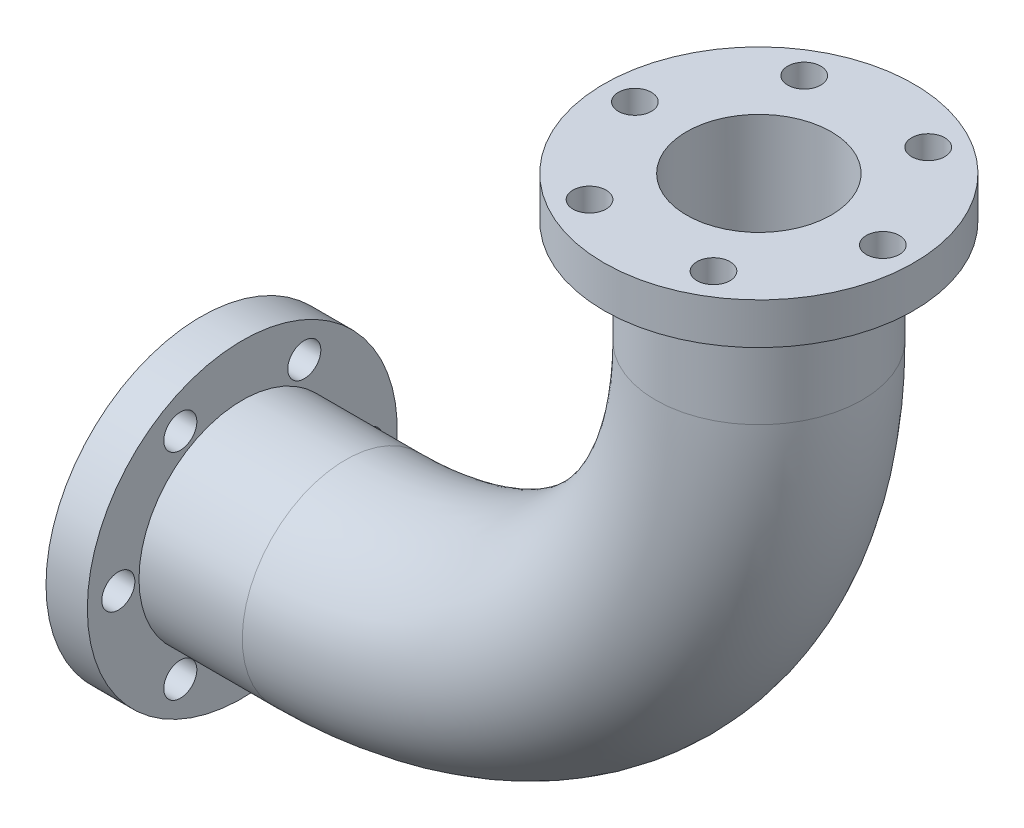
ISO-10303-21;
HEADER;
FILE_DESCRIPTION(('STEP AP214'),'2;1');
FILE_NAME('part.step','',(''),(''),'','','');
FILE_SCHEMA(('AUTOMOTIVE_DESIGN { 1 0 10303 214 1 1 1 1 }'));
ENDSEC;
DATA;
#1=APPLICATION_CONTEXT('core data for automotive mechanical design processes');
#2=APPLICATION_PROTOCOL_DEFINITION('international standard','automotive_design',2000,#1);
#3=PRODUCT_CONTEXT('',#1,'mechanical');
#4=PRODUCT('Part','Part','',(#3));
#5=PRODUCT_RELATED_PRODUCT_CATEGORY('part','',(#4));
#6=PRODUCT_DEFINITION_FORMATION('','',#4);
#7=PRODUCT_DEFINITION_CONTEXT('part definition',#1,'design');
#8=PRODUCT_DEFINITION('design','',#6,#7);
#9=PRODUCT_DEFINITION_SHAPE('','',#8);
#10=(LENGTH_UNIT() NAMED_UNIT(*) SI_UNIT(.MILLI.,.METRE.));
#11=(NAMED_UNIT(*) PLANE_ANGLE_UNIT() SI_UNIT($,.RADIAN.));
#12=(NAMED_UNIT(*) SI_UNIT($,.STERADIAN.) SOLID_ANGLE_UNIT());
#13=UNCERTAINTY_MEASURE_WITH_UNIT(LENGTH_MEASURE(1.E-05),#10,'distance_accuracy_value','');
#14=(GEOMETRIC_REPRESENTATION_CONTEXT(3) GLOBAL_UNCERTAINTY_ASSIGNED_CONTEXT((#13)) GLOBAL_UNIT_ASSIGNED_CONTEXT((#10,
#11,#12)) REPRESENTATION_CONTEXT('',''));
#15=CARTESIAN_POINT('',(0.,0.,0.));
#16=DIRECTION('',(0.,0.,1.));
#17=DIRECTION('',(1.,0.,0.));
#18=AXIS2_PLACEMENT_3D('',#15,#16,#17);
#19=CARTESIAN_POINT('',(0.,0.,0.));
#20=DIRECTION('',(1.,0.,0.));
#21=DIRECTION('',(0.,0.,-1.));
#22=AXIS2_PLACEMENT_3D('',#19,#20,#21);
#23=PLANE('',#22);
#24=CARTESIAN_POINT('',(0.,51.9615242270662,-30.0000000000002));
#25=DIRECTION('',(-1.,0.,0.));
#26=DIRECTION('',(0.,0.,1.));
#27=AXIS2_PLACEMENT_3D('',#24,#25,#26);
#28=CIRCLE('',#27,8.00000000000001);
#29=CARTESIAN_POINT('',(0.,51.9615242270662,-22.0000000000002));
#30=VERTEX_POINT('',#29);
#31=EDGE_CURVE('E271',#30,#30,#28,.T.);
#32=ORIENTED_EDGE('',*,*,#31,.F.);
#33=EDGE_LOOP('',(#32));
#34=FACE_BOUND('',#33,.T.);
#35=CARTESIAN_POINT('',(0.,0.,60.));
#36=DIRECTION('',(-1.,0.,0.));
#37=DIRECTION('',(0.,0.,1.));
#38=AXIS2_PLACEMENT_3D('',#35,#36,#37);
#39=CIRCLE('',#38,8.00000000000001);
#40=CARTESIAN_POINT('',(0.,0.,68.));
#41=VERTEX_POINT('',#40);
#42=EDGE_CURVE('E287',#41,#41,#39,.T.);
#43=ORIENTED_EDGE('',*,*,#42,.F.);
#44=EDGE_LOOP('',(#43));
#45=FACE_BOUND('',#44,.T.);
#46=CARTESIAN_POINT('',(0.,0.,0.));
#47=DIRECTION('',(1.,0.,0.));
#48=DIRECTION('',(0.,0.,-1.));
#49=AXIS2_PLACEMENT_3D('',#46,#47,#48);
#50=CIRCLE('',#49,35.);
#51=CARTESIAN_POINT('',(0.,0.,-35.));
#52=VERTEX_POINT('',#51);
#53=EDGE_CURVE('E70',#52,#52,#50,.F.);
#54=ORIENTED_EDGE('',*,*,#53,.F.);
#55=EDGE_LOOP('',(#54));
#56=FACE_BOUND('',#55,.T.);
#57=CARTESIAN_POINT('',(0.,0.,0.));
#58=DIRECTION('',(-1.,0.,0.));
#59=DIRECTION('',(0.,0.,1.));
#60=AXIS2_PLACEMENT_3D('',#57,#58,#59);
#61=CIRCLE('',#60,75.);
#62=CARTESIAN_POINT('',(0.,0.,75.));
#63=VERTEX_POINT('',#62);
#64=EDGE_CURVE('E295',#63,#63,#61,.T.);
#65=ORIENTED_EDGE('',*,*,#64,.T.);
#66=EDGE_LOOP('',(#65));
#67=FACE_BOUND('',#66,.T.);
#68=CARTESIAN_POINT('',(0.,51.9615242270664,29.9999999999999));
#69=DIRECTION('',(-1.,0.,0.));
#70=DIRECTION('',(0.,0.,1.));
#71=AXIS2_PLACEMENT_3D('',#68,#69,#70);
#72=CIRCLE('',#71,8.00000000000001);
#73=CARTESIAN_POINT('',(0.,51.9615242270664,37.9999999999999));
#74=VERTEX_POINT('',#73);
#75=EDGE_CURVE('E279',#74,#74,#72,.T.);
#76=ORIENTED_EDGE('',*,*,#75,.F.);
#77=EDGE_LOOP('',(#76));
#78=FACE_BOUND('',#77,.T.);
#79=CARTESIAN_POINT('',(0.,0.,-60.));
#80=DIRECTION('',(-1.,0.,0.));
#81=DIRECTION('',(0.,0.,1.));
#82=AXIS2_PLACEMENT_3D('',#79,#80,#81);
#83=CIRCLE('',#82,8.00000000000001);
#84=CARTESIAN_POINT('',(0.,0.,-52.));
#85=VERTEX_POINT('',#84);
#86=EDGE_CURVE('E263',#85,#85,#83,.T.);
#87=ORIENTED_EDGE('',*,*,#86,.F.);
#88=EDGE_LOOP('',(#87));
#89=FACE_BOUND('',#88,.T.);
#90=CARTESIAN_POINT('',(0.,-51.9615242270666,-29.9999999999995));
#91=DIRECTION('',(-1.,0.,0.));
#92=DIRECTION('',(0.,0.,1.));
#93=AXIS2_PLACEMENT_3D('',#90,#91,#92);
#94=CIRCLE('',#93,8.00000000000001);
#95=CARTESIAN_POINT('',(0.,-51.9615242270666,-21.9999999999995));
#96=VERTEX_POINT('',#95);
#97=EDGE_CURVE('E255',#96,#96,#94,.T.);
#98=ORIENTED_EDGE('',*,*,#97,.F.);
#99=EDGE_LOOP('',(#98));
#100=FACE_BOUND('',#99,.T.);
#101=CARTESIAN_POINT('',(0.,-51.961524227066,30.0000000000006));
#102=DIRECTION('',(-1.,0.,0.));
#103=DIRECTION('',(0.,0.,1.));
#104=AXIS2_PLACEMENT_3D('',#101,#102,#103);
#105=CIRCLE('',#104,8.00000000000001);
#106=CARTESIAN_POINT('',(0.,-51.961524227066,38.0000000000006));
#107=VERTEX_POINT('',#106);
#108=EDGE_CURVE('E247',#107,#107,#105,.T.);
#109=ORIENTED_EDGE('',*,*,#108,.F.);
#110=EDGE_LOOP('',(#109));
#111=FACE_BOUND('',#110,.T.);
#112=ADVANCED_FACE('F43',(#34,#45,#56,#67,#78,#89,#100,#111),#23,.F.);
#113=CARTESIAN_POINT('',(0.,0.,0.));
#114=DIRECTION('',(1.,0.,0.));
#115=DIRECTION('',(0.,0.,-1.));
#116=AXIS2_PLACEMENT_3D('',#113,#114,#115);
#117=CYLINDRICAL_SURFACE('',#116,50.);
#118=CARTESIAN_POINT('',(70.,0.,0.));
#119=DIRECTION('',(1.,0.,0.));
#120=DIRECTION('',(0.,0.,-1.));
#121=AXIS2_PLACEMENT_3D('',#118,#119,#120);
#122=CIRCLE('',#121,50.);
#123=CARTESIAN_POINT('',(70.,-50.,0.));
#124=VERTEX_POINT('',#123);
#125=EDGE_CURVE('E61',#124,#124,#122,.T.);
#126=ORIENTED_EDGE('',*,*,#125,.F.);
#127=EDGE_LOOP('',(#126));
#128=FACE_BOUND('',#127,.T.);
#129=CARTESIAN_POINT('',(20.,0.,0.));
#130=DIRECTION('',(-1.,0.,0.));
#131=DIRECTION('',(0.,0.,1.));
#132=AXIS2_PLACEMENT_3D('',#129,#130,#131);
#133=CIRCLE('',#132,50.);
#134=CARTESIAN_POINT('',(20.,0.,50.));
#135=VERTEX_POINT('',#134);
#136=EDGE_CURVE('E300',#135,#135,#133,.F.);
#137=ORIENTED_EDGE('',*,*,#136,.T.);
#138=EDGE_LOOP('',(#137));
#139=FACE_BOUND('',#138,.T.);
#140=ADVANCED_FACE('F109',(#128,#139),#117,.T.);
#141=CARTESIAN_POINT('',(270.,200.,0.));
#142=DIRECTION('',(0.,1.,0.));
#143=DIRECTION('',(0.,0.,1.));
#144=AXIS2_PLACEMENT_3D('',#141,#142,#143);
#145=CYLINDRICAL_SURFACE('',#144,50.);
#146=CARTESIAN_POINT('',(270.,200.,0.));
#147=DIRECTION('',(0.,1.,0.));
#148=DIRECTION('',(0.,0.,-1.));
#149=AXIS2_PLACEMENT_3D('',#146,#147,#148);
#150=CIRCLE('',#149,50.);
#151=CARTESIAN_POINT('',(320.,200.,0.));
#152=VERTEX_POINT('',#151);
#153=EDGE_CURVE('E47',#152,#152,#150,.T.);
#154=ORIENTED_EDGE('',*,*,#153,.T.);
#155=EDGE_LOOP('',(#154));
#156=FACE_BOUND('',#155,.T.);
#157=CARTESIAN_POINT('',(270.,250.,0.));
#158=DIRECTION('',(0.,1.,0.));
#159=DIRECTION('',(0.,0.,1.));
#160=AXIS2_PLACEMENT_3D('',#157,#158,#159);
#161=CIRCLE('',#160,50.);
#162=CARTESIAN_POINT('',(270.,250.,50.));
#163=VERTEX_POINT('',#162);
#164=EDGE_CURVE('E64',#163,#163,#161,.F.);
#165=ORIENTED_EDGE('',*,*,#164,.T.);
#166=EDGE_LOOP('',(#165));
#167=FACE_BOUND('',#166,.T.);
#168=ADVANCED_FACE('F45',(#156,#167),#145,.T.);
#169=CARTESIAN_POINT('',(70.,200.,0.));
#170=DIRECTION('',(0.,0.,1.));
#171=DIRECTION('',(1.,0.,0.));
#172=AXIS2_PLACEMENT_3D('',#169,#170,#171);
#173=TOROIDAL_SURFACE('',#172,200.,50.);
#174=CARTESIAN_POINT('',(70.,200.,0.));
#175=DIRECTION('',(0.,0.,1.));
#176=DIRECTION('',(1.,0.,0.));
#177=AXIS2_PLACEMENT_3D('',#174,#175,#176);
#178=CIRCLE('',#177,250.);
#179=EDGE_CURVE('',#124,#152,#178,.T.);
#180=ORIENTED_EDGE('',*,*,#125,.T.);
#181=ORIENTED_EDGE('',*,*,#153,.F.);
#182=ORIENTED_EDGE('',*,*,#179,.T.);
#183=ORIENTED_EDGE('',*,*,#179,.F.);
#184=EDGE_LOOP('',(#180,#182,#181,#183));
#185=FACE_BOUND('',#184,.T.);
#186=ADVANCED_FACE('F104',(#185),#173,.T.);
#187=CARTESIAN_POINT('',(270.,270.,0.));
#188=DIRECTION('',(0.,1.,0.));
#189=DIRECTION('',(0.,0.,-1.));
#190=AXIS2_PLACEMENT_3D('',#187,#188,#189);
#191=PLANE('',#190);
#192=CARTESIAN_POINT('',(300.000000000001,270.,-51.961524227066));
#193=DIRECTION('',(0.,1.,0.));
#194=DIRECTION('',(0.,0.,1.));
#195=AXIS2_PLACEMENT_3D('',#192,#193,#194);
#196=CIRCLE('',#195,8.00000000000001);
#197=CARTESIAN_POINT('',(300.000000000001,270.,-43.961524227066));
#198=VERTEX_POINT('',#197);
#199=EDGE_CURVE('E201',#198,#198,#196,.T.);
#200=ORIENTED_EDGE('',*,*,#199,.F.);
#201=EDGE_LOOP('',(#200));
#202=FACE_BOUND('',#201,.T.);
#203=CARTESIAN_POINT('',(240.000000000001,270.,-51.9615242270666));
#204=DIRECTION('',(0.,1.,0.));
#205=DIRECTION('',(0.,0.,1.));
#206=AXIS2_PLACEMENT_3D('',#203,#204,#205);
#207=CIRCLE('',#206,8.00000000000001);
#208=CARTESIAN_POINT('',(240.000000000001,270.,-43.9615242270666));
#209=VERTEX_POINT('',#208);
#210=EDGE_CURVE('E205',#209,#209,#207,.T.);
#211=ORIENTED_EDGE('',*,*,#210,.F.);
#212=EDGE_LOOP('',(#211));
#213=FACE_BOUND('',#212,.T.);
#214=CARTESIAN_POINT('',(210.,270.,0.));
#215=DIRECTION('',(0.,1.,0.));
#216=DIRECTION('',(0.,0.,1.));
#217=AXIS2_PLACEMENT_3D('',#214,#215,#216);
#218=CIRCLE('',#217,8.00000000000001);
#219=CARTESIAN_POINT('',(210.,270.,8.00000000000001));
#220=VERTEX_POINT('',#219);
#221=EDGE_CURVE('E215',#220,#220,#218,.T.);
#222=ORIENTED_EDGE('',*,*,#221,.F.);
#223=EDGE_LOOP('',(#222));
#224=FACE_BOUND('',#223,.T.);
#225=CARTESIAN_POINT('',(240.,270.,51.9615242270662));
#226=DIRECTION('',(0.,1.,0.));
#227=DIRECTION('',(0.,0.,1.));
#228=AXIS2_PLACEMENT_3D('',#225,#226,#227);
#229=CIRCLE('',#228,8.00000000000001);
#230=CARTESIAN_POINT('',(240.,270.,59.9615242270662));
#231=VERTEX_POINT('',#230);
#232=EDGE_CURVE('E223',#231,#231,#229,.T.);
#233=ORIENTED_EDGE('',*,*,#232,.F.);
#234=EDGE_LOOP('',(#233));
#235=FACE_BOUND('',#234,.T.);
#236=CARTESIAN_POINT('',(300.,270.,51.9615242270664));
#237=DIRECTION('',(0.,1.,0.));
#238=DIRECTION('',(0.,0.,1.));
#239=AXIS2_PLACEMENT_3D('',#236,#237,#238);
#240=CIRCLE('',#239,8.00000000000001);
#241=CARTESIAN_POINT('',(300.,270.,59.9615242270664));
#242=VERTEX_POINT('',#241);
#243=EDGE_CURVE('E231',#242,#242,#240,.T.);
#244=ORIENTED_EDGE('',*,*,#243,.F.);
#245=EDGE_LOOP('',(#244));
#246=FACE_BOUND('',#245,.T.);
#247=CARTESIAN_POINT('',(330.,270.,0.));
#248=DIRECTION('',(0.,1.,0.));
#249=DIRECTION('',(0.,0.,1.));
#250=AXIS2_PLACEMENT_3D('',#247,#248,#249);
#251=CIRCLE('',#250,8.00000000000001);
#252=CARTESIAN_POINT('',(330.,270.,8.00000000000001));
#253=VERTEX_POINT('',#252);
#254=EDGE_CURVE('E239',#253,#253,#251,.T.);
#255=ORIENTED_EDGE('',*,*,#254,.F.);
#256=EDGE_LOOP('',(#255));
#257=FACE_BOUND('',#256,.T.);
#258=CARTESIAN_POINT('',(270.,270.,0.));
#259=DIRECTION('',(0.,1.,0.));
#260=DIRECTION('',(0.,0.,-1.));
#261=AXIS2_PLACEMENT_3D('',#258,#259,#260);
#262=CIRCLE('',#261,35.);
#263=CARTESIAN_POINT('',(270.,270.,-35.));
#264=VERTEX_POINT('',#263);
#265=EDGE_CURVE('E10',#264,#264,#262,.F.);
#266=ORIENTED_EDGE('',*,*,#265,.T.);
#267=EDGE_LOOP('',(#266));
#268=FACE_BOUND('',#267,.T.);
#269=CARTESIAN_POINT('',(270.,270.,0.));
#270=DIRECTION('',(0.,1.,0.));
#271=DIRECTION('',(0.,0.,1.));
#272=AXIS2_PLACEMENT_3D('',#269,#270,#271);
#273=CIRCLE('',#272,75.);
#274=CARTESIAN_POINT('',(270.,270.,75.));
#275=VERTEX_POINT('',#274);
#276=EDGE_CURVE('E78',#275,#275,#273,.T.);
#277=ORIENTED_EDGE('',*,*,#276,.T.);
#278=EDGE_LOOP('',(#277));
#279=FACE_BOUND('',#278,.T.);
#280=ADVANCED_FACE('F92',(#202,#213,#224,#235,#246,#257,#268,#279),#191,.T.);
#281=CARTESIAN_POINT('',(0.,0.,0.));
#282=DIRECTION('',(1.,0.,0.));
#283=DIRECTION('',(0.,0.,-1.));
#284=AXIS2_PLACEMENT_3D('',#281,#282,#283);
#285=CYLINDRICAL_SURFACE('',#284,35.);
#286=ORIENTED_EDGE('',*,*,#53,.T.);
#287=EDGE_LOOP('',(#286));
#288=FACE_BOUND('',#287,.T.);
#289=CARTESIAN_POINT('',(70.,0.,0.));
#290=DIRECTION('',(1.,0.,0.));
#291=DIRECTION('',(0.,0.,-1.));
#292=AXIS2_PLACEMENT_3D('',#289,#290,#291);
#293=CIRCLE('',#292,35.);
#294=CARTESIAN_POINT('',(70.,-35.,0.));
#295=VERTEX_POINT('',#294);
#296=EDGE_CURVE('E58',#295,#295,#293,.F.);
#297=ORIENTED_EDGE('',*,*,#296,.F.);
#298=EDGE_LOOP('',(#297));
#299=FACE_BOUND('',#298,.T.);
#300=ADVANCED_FACE('F90',(#288,#299),#285,.F.);
#301=CARTESIAN_POINT('',(70.,200.,0.));
#302=DIRECTION('',(0.,0.,1.));
#303=DIRECTION('',(1.,0.,0.));
#304=AXIS2_PLACEMENT_3D('',#301,#302,#303);
#305=TOROIDAL_SURFACE('',#304,200.,35.);
#306=CARTESIAN_POINT('',(270.,200.,0.));
#307=DIRECTION('',(0.,1.,0.));
#308=DIRECTION('',(0.,0.,-1.));
#309=AXIS2_PLACEMENT_3D('',#306,#307,#308);
#310=CIRCLE('',#309,35.);
#311=CARTESIAN_POINT('',(305.,200.,0.));
#312=VERTEX_POINT('',#311);
#313=EDGE_CURVE('E52',#312,#312,#310,.F.);
#314=CARTESIAN_POINT('',(70.,200.,0.));
#315=DIRECTION('',(0.,0.,1.));
#316=DIRECTION('',(1.,0.,0.));
#317=AXIS2_PLACEMENT_3D('',#314,#315,#316);
#318=CIRCLE('',#317,235.);
#319=EDGE_CURVE('',#295,#312,#318,.T.);
#320=ORIENTED_EDGE('',*,*,#296,.T.);
#321=ORIENTED_EDGE('',*,*,#313,.F.);
#322=ORIENTED_EDGE('',*,*,#319,.T.);
#323=ORIENTED_EDGE('',*,*,#319,.F.);
#324=EDGE_LOOP('',(#320,#322,#321,#323));
#325=FACE_BOUND('',#324,.T.);
#326=ADVANCED_FACE('F88',(#325),#305,.F.);
#327=CARTESIAN_POINT('',(270.,200.,0.));
#328=DIRECTION('',(0.,1.,0.));
#329=DIRECTION('',(0.,0.,1.));
#330=AXIS2_PLACEMENT_3D('',#327,#328,#329);
#331=CYLINDRICAL_SURFACE('',#330,35.);
#332=ORIENTED_EDGE('',*,*,#265,.F.);
#333=EDGE_LOOP('',(#332));
#334=FACE_BOUND('',#333,.T.);
#335=ORIENTED_EDGE('',*,*,#313,.T.);
#336=EDGE_LOOP('',(#335));
#337=FACE_BOUND('',#336,.T.);
#338=ADVANCED_FACE('F100',(#334,#337),#331,.F.);
#339=CARTESIAN_POINT('',(270.,250.,0.));
#340=DIRECTION('',(0.,1.,0.));
#341=DIRECTION('',(0.,0.,1.));
#342=AXIS2_PLACEMENT_3D('',#339,#340,#341);
#343=CYLINDRICAL_SURFACE('',#342,75.);
#344=CARTESIAN_POINT('',(270.,250.,0.));
#345=DIRECTION('',(0.,1.,0.));
#346=DIRECTION('',(0.,0.,1.));
#347=AXIS2_PLACEMENT_3D('',#344,#345,#346);
#348=CIRCLE('',#347,75.);
#349=CARTESIAN_POINT('',(270.,250.,75.));
#350=VERTEX_POINT('',#349);
#351=EDGE_CURVE('E72',#350,#350,#348,.T.);
#352=ORIENTED_EDGE('',*,*,#351,.T.);
#353=EDGE_LOOP('',(#352));
#354=FACE_BOUND('',#353,.T.);
#355=ORIENTED_EDGE('',*,*,#276,.F.);
#356=EDGE_LOOP('',(#355));
#357=FACE_BOUND('',#356,.T.);
#358=ADVANCED_FACE('F123',(#354,#357),#343,.T.);
#359=CARTESIAN_POINT('',(270.,250.,0.));
#360=DIRECTION('',(0.,1.,0.));
#361=DIRECTION('',(0.,0.,1.));
#362=AXIS2_PLACEMENT_3D('',#359,#360,#361);
#363=PLANE('',#362);
#364=CARTESIAN_POINT('',(300.000000000001,250.,-51.961524227066));
#365=DIRECTION('',(0.,1.,0.));
#366=DIRECTION('',(0.,0.,1.));
#367=AXIS2_PLACEMENT_3D('',#364,#365,#366);
#368=CIRCLE('',#367,8.00000000000001);
#369=CARTESIAN_POINT('',(300.000000000001,250.,-43.961524227066));
#370=VERTEX_POINT('',#369);
#371=EDGE_CURVE('E198',#370,#370,#368,.T.);
#372=ORIENTED_EDGE('',*,*,#371,.T.);
#373=EDGE_LOOP('',(#372));
#374=FACE_BOUND('',#373,.T.);
#375=CARTESIAN_POINT('',(240.000000000001,250.,-51.9615242270666));
#376=DIRECTION('',(0.,1.,0.));
#377=DIRECTION('',(0.,0.,1.));
#378=AXIS2_PLACEMENT_3D('',#375,#376,#377);
#379=CIRCLE('',#378,8.00000000000001);
#380=CARTESIAN_POINT('',(240.000000000001,250.,-43.9615242270666));
#381=VERTEX_POINT('',#380);
#382=EDGE_CURVE('E211',#381,#381,#379,.T.);
#383=ORIENTED_EDGE('',*,*,#382,.T.);
#384=EDGE_LOOP('',(#383));
#385=FACE_BOUND('',#384,.T.);
#386=CARTESIAN_POINT('',(210.,250.,0.));
#387=DIRECTION('',(0.,1.,0.));
#388=DIRECTION('',(0.,0.,1.));
#389=AXIS2_PLACEMENT_3D('',#386,#387,#388);
#390=CIRCLE('',#389,8.00000000000001);
#391=CARTESIAN_POINT('',(210.,250.,8.00000000000001));
#392=VERTEX_POINT('',#391);
#393=EDGE_CURVE('E219',#392,#392,#390,.T.);
#394=ORIENTED_EDGE('',*,*,#393,.T.);
#395=EDGE_LOOP('',(#394));
#396=FACE_BOUND('',#395,.T.);
#397=CARTESIAN_POINT('',(240.,250.,51.9615242270662));
#398=DIRECTION('',(0.,1.,0.));
#399=DIRECTION('',(0.,0.,1.));
#400=AXIS2_PLACEMENT_3D('',#397,#398,#399);
#401=CIRCLE('',#400,8.00000000000001);
#402=CARTESIAN_POINT('',(240.,250.,59.9615242270662));
#403=VERTEX_POINT('',#402);
#404=EDGE_CURVE('E227',#403,#403,#401,.T.);
#405=ORIENTED_EDGE('',*,*,#404,.T.);
#406=EDGE_LOOP('',(#405));
#407=FACE_BOUND('',#406,.T.);
#408=CARTESIAN_POINT('',(300.,250.,51.9615242270664));
#409=DIRECTION('',(0.,1.,0.));
#410=DIRECTION('',(0.,0.,1.));
#411=AXIS2_PLACEMENT_3D('',#408,#409,#410);
#412=CIRCLE('',#411,8.00000000000001);
#413=CARTESIAN_POINT('',(300.,250.,59.9615242270664));
#414=VERTEX_POINT('',#413);
#415=EDGE_CURVE('E235',#414,#414,#412,.T.);
#416=ORIENTED_EDGE('',*,*,#415,.T.);
#417=EDGE_LOOP('',(#416));
#418=FACE_BOUND('',#417,.T.);
#419=CARTESIAN_POINT('',(330.,250.,0.));
#420=DIRECTION('',(0.,1.,0.));
#421=DIRECTION('',(0.,0.,1.));
#422=AXIS2_PLACEMENT_3D('',#419,#420,#421);
#423=CIRCLE('',#422,8.00000000000001);
#424=CARTESIAN_POINT('',(330.,250.,8.00000000000001));
#425=VERTEX_POINT('',#424);
#426=EDGE_CURVE('E243',#425,#425,#423,.T.);
#427=ORIENTED_EDGE('',*,*,#426,.T.);
#428=EDGE_LOOP('',(#427));
#429=FACE_BOUND('',#428,.T.);
#430=ORIENTED_EDGE('',*,*,#164,.F.);
#431=EDGE_LOOP('',(#430));
#432=FACE_BOUND('',#431,.T.);
#433=ORIENTED_EDGE('',*,*,#351,.F.);
#434=EDGE_LOOP('',(#433));
#435=FACE_BOUND('',#434,.T.);
#436=ADVANCED_FACE('F130',(#374,#385,#396,#407,#418,#429,#432,#435),#363,.F.);
#437=CARTESIAN_POINT('',(20.,0.,0.));
#438=DIRECTION('',(-1.,0.,0.));
#439=DIRECTION('',(0.,0.,1.));
#440=AXIS2_PLACEMENT_3D('',#437,#438,#439);
#441=CYLINDRICAL_SURFACE('',#440,75.);
#442=CARTESIAN_POINT('',(20.,0.,0.));
#443=DIRECTION('',(-1.,0.,0.));
#444=DIRECTION('',(0.,0.,1.));
#445=AXIS2_PLACEMENT_3D('',#442,#443,#444);
#446=CIRCLE('',#445,75.);
#447=CARTESIAN_POINT('',(20.,0.,75.));
#448=VERTEX_POINT('',#447);
#449=EDGE_CURVE('E296',#448,#448,#446,.T.);
#450=ORIENTED_EDGE('',*,*,#449,.T.);
#451=EDGE_LOOP('',(#450));
#452=FACE_BOUND('',#451,.T.);
#453=ORIENTED_EDGE('',*,*,#64,.F.);
#454=EDGE_LOOP('',(#453));
#455=FACE_BOUND('',#454,.T.);
#456=ADVANCED_FACE('F136',(#452,#455),#441,.T.);
#457=CARTESIAN_POINT('',(20.,0.,0.));
#458=DIRECTION('',(-1.,0.,0.));
#459=DIRECTION('',(0.,0.,1.));
#460=AXIS2_PLACEMENT_3D('',#457,#458,#459);
#461=PLANE('',#460);
#462=CARTESIAN_POINT('',(20.,-51.961524227066,30.0000000000006));
#463=DIRECTION('',(-1.,0.,0.));
#464=DIRECTION('',(0.,0.,1.));
#465=AXIS2_PLACEMENT_3D('',#462,#463,#464);
#466=CIRCLE('',#465,8.00000000000001);
#467=CARTESIAN_POINT('',(20.,-51.961524227066,38.0000000000006));
#468=VERTEX_POINT('',#467);
#469=EDGE_CURVE('E251',#468,#468,#466,.T.);
#470=ORIENTED_EDGE('',*,*,#469,.T.);
#471=EDGE_LOOP('',(#470));
#472=FACE_BOUND('',#471,.T.);
#473=CARTESIAN_POINT('',(20.,-51.9615242270666,-29.9999999999995));
#474=DIRECTION('',(-1.,0.,0.));
#475=DIRECTION('',(0.,0.,1.));
#476=AXIS2_PLACEMENT_3D('',#473,#474,#475);
#477=CIRCLE('',#476,8.00000000000001);
#478=CARTESIAN_POINT('',(20.,-51.9615242270666,-21.9999999999995));
#479=VERTEX_POINT('',#478);
#480=EDGE_CURVE('E259',#479,#479,#477,.T.);
#481=ORIENTED_EDGE('',*,*,#480,.T.);
#482=EDGE_LOOP('',(#481));
#483=FACE_BOUND('',#482,.T.);
#484=CARTESIAN_POINT('',(20.,0.,-60.));
#485=DIRECTION('',(-1.,0.,0.));
#486=DIRECTION('',(0.,0.,1.));
#487=AXIS2_PLACEMENT_3D('',#484,#485,#486);
#488=CIRCLE('',#487,8.00000000000001);
#489=CARTESIAN_POINT('',(20.,0.,-52.));
#490=VERTEX_POINT('',#489);
#491=EDGE_CURVE('E267',#490,#490,#488,.T.);
#492=ORIENTED_EDGE('',*,*,#491,.T.);
#493=EDGE_LOOP('',(#492));
#494=FACE_BOUND('',#493,.T.);
#495=CARTESIAN_POINT('',(20.,51.9615242270662,-30.0000000000002));
#496=DIRECTION('',(-1.,0.,0.));
#497=DIRECTION('',(0.,0.,1.));
#498=AXIS2_PLACEMENT_3D('',#495,#496,#497);
#499=CIRCLE('',#498,8.00000000000001);
#500=CARTESIAN_POINT('',(20.,51.9615242270662,-22.0000000000002));
#501=VERTEX_POINT('',#500);
#502=EDGE_CURVE('E275',#501,#501,#499,.T.);
#503=ORIENTED_EDGE('',*,*,#502,.T.);
#504=EDGE_LOOP('',(#503));
#505=FACE_BOUND('',#504,.T.);
#506=CARTESIAN_POINT('',(20.,51.9615242270664,29.9999999999999));
#507=DIRECTION('',(-1.,0.,0.));
#508=DIRECTION('',(0.,0.,1.));
#509=AXIS2_PLACEMENT_3D('',#506,#507,#508);
#510=CIRCLE('',#509,8.00000000000001);
#511=CARTESIAN_POINT('',(20.,51.9615242270664,37.9999999999999));
#512=VERTEX_POINT('',#511);
#513=EDGE_CURVE('E283',#512,#512,#510,.T.);
#514=ORIENTED_EDGE('',*,*,#513,.T.);
#515=EDGE_LOOP('',(#514));
#516=FACE_BOUND('',#515,.T.);
#517=CARTESIAN_POINT('',(20.,0.,60.));
#518=DIRECTION('',(-1.,0.,0.));
#519=DIRECTION('',(0.,0.,1.));
#520=AXIS2_PLACEMENT_3D('',#517,#518,#519);
#521=CIRCLE('',#520,8.00000000000001);
#522=CARTESIAN_POINT('',(20.,0.,68.));
#523=VERTEX_POINT('',#522);
#524=EDGE_CURVE('E291',#523,#523,#521,.T.);
#525=ORIENTED_EDGE('',*,*,#524,.T.);
#526=EDGE_LOOP('',(#525));
#527=FACE_BOUND('',#526,.T.);
#528=ORIENTED_EDGE('',*,*,#136,.F.);
#529=EDGE_LOOP('',(#528));
#530=FACE_BOUND('',#529,.T.);
#531=ORIENTED_EDGE('',*,*,#449,.F.);
#532=EDGE_LOOP('',(#531));
#533=FACE_BOUND('',#532,.T.);
#534=ADVANCED_FACE('F143',(#472,#483,#494,#505,#516,#527,#530,#533),#461,.F.);
#535=CARTESIAN_POINT('',(0.,0.,60.));
#536=DIRECTION('',(-1.,0.,0.));
#537=DIRECTION('',(0.,0.,1.));
#538=AXIS2_PLACEMENT_3D('',#535,#536,#537);
#539=CYLINDRICAL_SURFACE('',#538,8.00000000000001);
#540=ORIENTED_EDGE('',*,*,#524,.F.);
#541=EDGE_LOOP('',(#540));
#542=FACE_BOUND('',#541,.T.);
#543=ORIENTED_EDGE('',*,*,#42,.T.);
#544=EDGE_LOOP('',(#543));
#545=FACE_BOUND('',#544,.T.);
#546=ADVANCED_FACE('F146',(#542,#545),#539,.F.);
#547=CARTESIAN_POINT('',(0.,51.9615242270664,29.9999999999999));
#548=DIRECTION('',(-1.,0.,0.));
#549=DIRECTION('',(0.,0.,1.));
#550=AXIS2_PLACEMENT_3D('',#547,#548,#549);
#551=CYLINDRICAL_SURFACE('',#550,8.00000000000001);
#552=ORIENTED_EDGE('',*,*,#513,.F.);
#553=EDGE_LOOP('',(#552));
#554=FACE_BOUND('',#553,.T.);
#555=ORIENTED_EDGE('',*,*,#75,.T.);
#556=EDGE_LOOP('',(#555));
#557=FACE_BOUND('',#556,.T.);
#558=ADVANCED_FACE('F149',(#554,#557),#551,.F.);
#559=CARTESIAN_POINT('',(0.,51.9615242270662,-30.0000000000002));
#560=DIRECTION('',(-1.,0.,0.));
#561=DIRECTION('',(0.,0.,1.));
#562=AXIS2_PLACEMENT_3D('',#559,#560,#561);
#563=CYLINDRICAL_SURFACE('',#562,8.00000000000001);
#564=ORIENTED_EDGE('',*,*,#502,.F.);
#565=EDGE_LOOP('',(#564));
#566=FACE_BOUND('',#565,.T.);
#567=ORIENTED_EDGE('',*,*,#31,.T.);
#568=EDGE_LOOP('',(#567));
#569=FACE_BOUND('',#568,.T.);
#570=ADVANCED_FACE('F153',(#566,#569),#563,.F.);
#571=CARTESIAN_POINT('',(0.,0.,-60.));
#572=DIRECTION('',(-1.,0.,0.));
#573=DIRECTION('',(0.,0.,1.));
#574=AXIS2_PLACEMENT_3D('',#571,#572,#573);
#575=CYLINDRICAL_SURFACE('',#574,8.00000000000001);
#576=ORIENTED_EDGE('',*,*,#491,.F.);
#577=EDGE_LOOP('',(#576));
#578=FACE_BOUND('',#577,.T.);
#579=ORIENTED_EDGE('',*,*,#86,.T.);
#580=EDGE_LOOP('',(#579));
#581=FACE_BOUND('',#580,.T.);
#582=ADVANCED_FACE('F157',(#578,#581),#575,.F.);
#583=CARTESIAN_POINT('',(0.,-51.9615242270666,-29.9999999999995));
#584=DIRECTION('',(-1.,0.,0.));
#585=DIRECTION('',(0.,0.,1.));
#586=AXIS2_PLACEMENT_3D('',#583,#584,#585);
#587=CYLINDRICAL_SURFACE('',#586,8.00000000000001);
#588=ORIENTED_EDGE('',*,*,#480,.F.);
#589=EDGE_LOOP('',(#588));
#590=FACE_BOUND('',#589,.T.);
#591=ORIENTED_EDGE('',*,*,#97,.T.);
#592=EDGE_LOOP('',(#591));
#593=FACE_BOUND('',#592,.T.);
#594=ADVANCED_FACE('F161',(#590,#593),#587,.F.);
#595=CARTESIAN_POINT('',(0.,-51.961524227066,30.0000000000006));
#596=DIRECTION('',(-1.,0.,0.));
#597=DIRECTION('',(0.,0.,1.));
#598=AXIS2_PLACEMENT_3D('',#595,#596,#597);
#599=CYLINDRICAL_SURFACE('',#598,8.00000000000001);
#600=ORIENTED_EDGE('',*,*,#469,.F.);
#601=EDGE_LOOP('',(#600));
#602=FACE_BOUND('',#601,.T.);
#603=ORIENTED_EDGE('',*,*,#108,.T.);
#604=EDGE_LOOP('',(#603));
#605=FACE_BOUND('',#604,.T.);
#606=ADVANCED_FACE('F165',(#602,#605),#599,.F.);
#607=CARTESIAN_POINT('',(330.,270.,0.));
#608=DIRECTION('',(0.,1.,0.));
#609=DIRECTION('',(0.,0.,1.));
#610=AXIS2_PLACEMENT_3D('',#607,#608,#609);
#611=CYLINDRICAL_SURFACE('',#610,8.00000000000001);
#612=ORIENTED_EDGE('',*,*,#426,.F.);
#613=EDGE_LOOP('',(#612));
#614=FACE_BOUND('',#613,.T.);
#615=ORIENTED_EDGE('',*,*,#254,.T.);
#616=EDGE_LOOP('',(#615));
#617=FACE_BOUND('',#616,.T.);
#618=ADVANCED_FACE('F169',(#614,#617),#611,.F.);
#619=CARTESIAN_POINT('',(300.,270.,51.9615242270664));
#620=DIRECTION('',(0.,1.,0.));
#621=DIRECTION('',(0.,0.,1.));
#622=AXIS2_PLACEMENT_3D('',#619,#620,#621);
#623=CYLINDRICAL_SURFACE('',#622,8.00000000000001);
#624=ORIENTED_EDGE('',*,*,#415,.F.);
#625=EDGE_LOOP('',(#624));
#626=FACE_BOUND('',#625,.T.);
#627=ORIENTED_EDGE('',*,*,#243,.T.);
#628=EDGE_LOOP('',(#627));
#629=FACE_BOUND('',#628,.T.);
#630=ADVANCED_FACE('F173',(#626,#629),#623,.F.);
#631=CARTESIAN_POINT('',(240.,270.,51.9615242270662));
#632=DIRECTION('',(0.,1.,0.));
#633=DIRECTION('',(0.,0.,1.));
#634=AXIS2_PLACEMENT_3D('',#631,#632,#633);
#635=CYLINDRICAL_SURFACE('',#634,8.00000000000001);
#636=ORIENTED_EDGE('',*,*,#404,.F.);
#637=EDGE_LOOP('',(#636));
#638=FACE_BOUND('',#637,.T.);
#639=ORIENTED_EDGE('',*,*,#232,.T.);
#640=EDGE_LOOP('',(#639));
#641=FACE_BOUND('',#640,.T.);
#642=ADVANCED_FACE('F177',(#638,#641),#635,.F.);
#643=CARTESIAN_POINT('',(210.,270.,0.));
#644=DIRECTION('',(0.,1.,0.));
#645=DIRECTION('',(0.,0.,1.));
#646=AXIS2_PLACEMENT_3D('',#643,#644,#645);
#647=CYLINDRICAL_SURFACE('',#646,8.00000000000001);
#648=ORIENTED_EDGE('',*,*,#393,.F.);
#649=EDGE_LOOP('',(#648));
#650=FACE_BOUND('',#649,.T.);
#651=ORIENTED_EDGE('',*,*,#221,.T.);
#652=EDGE_LOOP('',(#651));
#653=FACE_BOUND('',#652,.T.);
#654=ADVANCED_FACE('F181',(#650,#653),#647,.F.);
#655=CARTESIAN_POINT('',(240.000000000001,270.,-51.9615242270666));
#656=DIRECTION('',(0.,1.,0.));
#657=DIRECTION('',(0.,0.,1.));
#658=AXIS2_PLACEMENT_3D('',#655,#656,#657);
#659=CYLINDRICAL_SURFACE('',#658,8.00000000000001);
#660=ORIENTED_EDGE('',*,*,#382,.F.);
#661=EDGE_LOOP('',(#660));
#662=FACE_BOUND('',#661,.T.);
#663=ORIENTED_EDGE('',*,*,#210,.T.);
#664=EDGE_LOOP('',(#663));
#665=FACE_BOUND('',#664,.T.);
#666=ADVANCED_FACE('F185',(#662,#665),#659,.F.);
#667=CARTESIAN_POINT('',(300.000000000001,270.,-51.961524227066));
#668=DIRECTION('',(0.,1.,0.));
#669=DIRECTION('',(0.,0.,1.));
#670=AXIS2_PLACEMENT_3D('',#667,#668,#669);
#671=CYLINDRICAL_SURFACE('',#670,8.00000000000001);
#672=ORIENTED_EDGE('',*,*,#371,.F.);
#673=EDGE_LOOP('',(#672));
#674=FACE_BOUND('',#673,.T.);
#675=ORIENTED_EDGE('',*,*,#199,.T.);
#676=EDGE_LOOP('',(#675));
#677=FACE_BOUND('',#676,.T.);
#678=ADVANCED_FACE('F189',(#674,#677),#671,.F.);
#679=CLOSED_SHELL('',(#112,#140,#168,#186,#280,#300,#326,#338,#358,#436,#456,#534,#546,#558,
#570,#582,#594,#606,#618,#630,#642,#654,#666,#678));
#680=MANIFOLD_SOLID_BREP('B2',#679);
#681=ADVANCED_BREP_SHAPE_REPRESENTATION('',(#18,#680),#14);
#682=SHAPE_DEFINITION_REPRESENTATION(#9,#681);
ENDSEC;
END-ISO-10303-21;
